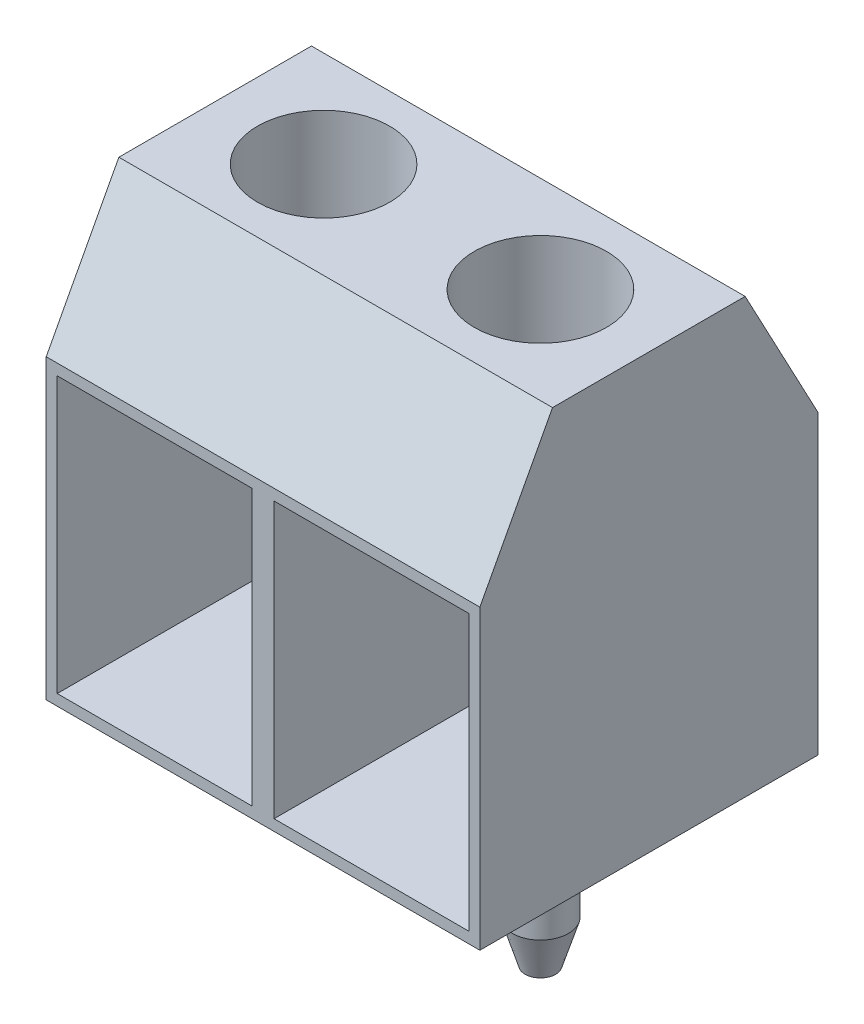
ISO-10303-21;
HEADER;
FILE_DESCRIPTION(('STEP AP214'),'2;1');
FILE_NAME('part.step','',(''),(''),'','','');
FILE_SCHEMA(('AUTOMOTIVE_DESIGN { 1 0 10303 214 1 1 1 1 }'));
ENDSEC;
DATA;
#1=APPLICATION_CONTEXT('core data for automotive mechanical design processes');
#2=APPLICATION_PROTOCOL_DEFINITION('international standard','automotive_design',2000,#1);
#3=PRODUCT_CONTEXT('',#1,'mechanical');
#4=PRODUCT('Part','Part','',(#3));
#5=PRODUCT_RELATED_PRODUCT_CATEGORY('part','',(#4));
#6=PRODUCT_DEFINITION_FORMATION('','',#4);
#7=PRODUCT_DEFINITION_CONTEXT('part definition',#1,'design');
#8=PRODUCT_DEFINITION('design','',#6,#7);
#9=PRODUCT_DEFINITION_SHAPE('','',#8);
#10=(LENGTH_UNIT() NAMED_UNIT(*) SI_UNIT(.MILLI.,.METRE.));
#11=(NAMED_UNIT(*) PLANE_ANGLE_UNIT() SI_UNIT($,.RADIAN.));
#12=(NAMED_UNIT(*) SI_UNIT($,.STERADIAN.) SOLID_ANGLE_UNIT());
#13=UNCERTAINTY_MEASURE_WITH_UNIT(LENGTH_MEASURE(1.E-05),#10,'distance_accuracy_value','');
#14=(GEOMETRIC_REPRESENTATION_CONTEXT(3) GLOBAL_UNCERTAINTY_ASSIGNED_CONTEXT((#13)) GLOBAL_UNIT_ASSIGNED_CONTEXT((#10,
#11,#12)) REPRESENTATION_CONTEXT('',''));
#15=CARTESIAN_POINT('',(0.,0.,0.));
#16=DIRECTION('',(0.,0.,1.));
#17=DIRECTION('',(1.,0.,0.));
#18=AXIS2_PLACEMENT_3D('',#15,#16,#17);
#19=CARTESIAN_POINT('',(5.0038,10.0076,3.8989));
#20=DIRECTION('',(-1.,0.,0.));
#21=DIRECTION('',(0.,0.,1.));
#22=AXIS2_PLACEMENT_3D('',#19,#20,#21);
#23=PLANE('',#22);
#24=DIRECTION('',(0.,-1.,0.));
#25=VECTOR('',#24,1.);
#26=CARTESIAN_POINT('',(5.0038,10.0076,-3.8989));
#27=LINE('',#26,#25);
#28=CARTESIAN_POINT('',(5.0038,6.858,-3.8989));
#29=VERTEX_POINT('',#28);
#30=CARTESIAN_POINT('',(5.0038,0.,-3.8989));
#31=VERTEX_POINT('',#30);
#32=EDGE_CURVE('E11',#29,#31,#27,.T.);
#33=ORIENTED_EDGE('',*,*,#32,.F.);
#34=DIRECTION('',(0.,0.882746759079244,0.469849081445404));
#35=VECTOR('',#34,1.);
#36=CARTESIAN_POINT('',(5.0038,3.13105846340969,-5.88259468883033));
#37=LINE('',#36,#35);
#38=CARTESIAN_POINT('',(5.0038,10.0076,-2.2225));
#39=VERTEX_POINT('',#38);
#40=EDGE_CURVE('E256',#29,#39,#37,.T.);
#41=ORIENTED_EDGE('',*,*,#40,.T.);
#42=DIRECTION('',(0.,0.,-1.));
#43=VECTOR('',#42,1.);
#44=CARTESIAN_POINT('',(5.0038,10.0076,3.8989));
#45=LINE('',#44,#43);
#46=CARTESIAN_POINT('',(5.0038,10.0076,2.2225));
#47=VERTEX_POINT('',#46);
#48=EDGE_CURVE('E284',#47,#39,#45,.T.);
#49=ORIENTED_EDGE('',*,*,#48,.F.);
#50=DIRECTION('',(0.,-0.882746759079244,0.469849081445404));
#51=VECTOR('',#50,1.);
#52=CARTESIAN_POINT('',(5.0038,3.13105846340969,5.88259468883033));
#53=LINE('',#52,#51);
#54=CARTESIAN_POINT('',(5.0038,6.858,3.8989));
#55=VERTEX_POINT('',#54);
#56=EDGE_CURVE('E272',#47,#55,#53,.T.);
#57=ORIENTED_EDGE('',*,*,#56,.T.);
#58=DIRECTION('',(0.,-1.,0.));
#59=VECTOR('',#58,1.);
#60=CARTESIAN_POINT('',(5.0038,10.0076,3.8989));
#61=LINE('',#60,#59);
#62=CARTESIAN_POINT('',(5.0038,0.,3.8989));
#63=VERTEX_POINT('',#62);
#64=EDGE_CURVE('E293',#55,#63,#61,.T.);
#65=ORIENTED_EDGE('',*,*,#64,.T.);
#66=DIRECTION('',(0.,0.,-1.));
#67=VECTOR('',#66,1.);
#68=CARTESIAN_POINT('',(5.0038,0.,3.8989));
#69=LINE('',#68,#67);
#70=EDGE_CURVE('E269',#63,#31,#69,.T.);
#71=ORIENTED_EDGE('',*,*,#70,.T.);
#72=EDGE_LOOP('',(#33,#41,#49,#57,#65,#71));
#73=FACE_BOUND('',#72,.T.);
#74=ADVANCED_FACE('F43',(#73),#23,.F.);
#75=CARTESIAN_POINT('',(-5.0038,10.0076,-3.8989));
#76=DIRECTION('',(0.,0.,1.));
#77=DIRECTION('',(1.,0.,0.));
#78=AXIS2_PLACEMENT_3D('',#75,#76,#77);
#79=PLANE('',#78);
#80=DIRECTION('',(0.,-1.,0.));
#81=VECTOR('',#80,1.);
#82=CARTESIAN_POINT('',(-5.0038,10.0076,-3.8989));
#83=LINE('',#82,#81);
#84=CARTESIAN_POINT('',(-5.0038,6.858,-3.8989));
#85=VERTEX_POINT('',#84);
#86=CARTESIAN_POINT('',(-5.0038,0.,-3.8989));
#87=VERTEX_POINT('',#86);
#88=EDGE_CURVE('E51',#85,#87,#83,.T.);
#89=ORIENTED_EDGE('',*,*,#88,.F.);
#90=DIRECTION('',(-1.,0.,0.));
#91=VECTOR('',#90,1.);
#92=CARTESIAN_POINT('',(5.0038,6.858,-3.8989));
#93=LINE('',#92,#91);
#94=EDGE_CURVE('E260',#29,#85,#93,.T.);
#95=ORIENTED_EDGE('',*,*,#94,.F.);
#96=ORIENTED_EDGE('',*,*,#32,.T.);
#97=DIRECTION('',(-1.,0.,0.));
#98=VECTOR('',#97,1.);
#99=CARTESIAN_POINT('',(-5.0038,0.,-3.8989));
#100=LINE('',#99,#98);
#101=EDGE_CURVE('E297',#31,#87,#100,.T.);
#102=ORIENTED_EDGE('',*,*,#101,.T.);
#103=EDGE_LOOP('',(#89,#95,#96,#102));
#104=FACE_BOUND('',#103,.T.);
#105=ADVANCED_FACE('F324',(#104),#79,.F.);
#106=CARTESIAN_POINT('',(-5.0038,10.0076,3.8989));
#107=DIRECTION('',(1.,0.,0.));
#108=DIRECTION('',(0.,0.,-1.));
#109=AXIS2_PLACEMENT_3D('',#106,#107,#108);
#110=PLANE('',#109);
#111=DIRECTION('',(0.,0.,1.));
#112=VECTOR('',#111,1.);
#113=CARTESIAN_POINT('',(-5.0038,10.0076,3.8989));
#114=LINE('',#113,#112);
#115=CARTESIAN_POINT('',(-5.0038,10.0076,-2.2225));
#116=VERTEX_POINT('',#115);
#117=CARTESIAN_POINT('',(-5.0038,10.0076,2.2225));
#118=VERTEX_POINT('',#117);
#119=EDGE_CURVE('E288',#116,#118,#114,.T.);
#120=ORIENTED_EDGE('',*,*,#119,.F.);
#121=DIRECTION('',(0.,0.882746759079244,0.469849081445404));
#122=VECTOR('',#121,1.);
#123=CARTESIAN_POINT('',(-5.0038,3.13105846340969,-5.88259468883033));
#124=LINE('',#123,#122);
#125=EDGE_CURVE('E261',#85,#116,#124,.T.);
#126=ORIENTED_EDGE('',*,*,#125,.F.);
#127=ORIENTED_EDGE('',*,*,#88,.T.);
#128=DIRECTION('',(0.,0.,1.));
#129=VECTOR('',#128,1.);
#130=CARTESIAN_POINT('',(-5.0038,0.,3.8989));
#131=LINE('',#130,#129);
#132=CARTESIAN_POINT('',(-5.0038,0.,3.8989));
#133=VERTEX_POINT('',#132);
#134=EDGE_CURVE('E301',#87,#133,#131,.T.);
#135=ORIENTED_EDGE('',*,*,#134,.T.);
#136=DIRECTION('',(0.,-1.,0.));
#137=VECTOR('',#136,1.);
#138=CARTESIAN_POINT('',(-5.0038,10.0076,3.8989));
#139=LINE('',#138,#137);
#140=CARTESIAN_POINT('',(-5.0038,6.858,3.8989));
#141=VERTEX_POINT('',#140);
#142=EDGE_CURVE('E310',#141,#133,#139,.T.);
#143=ORIENTED_EDGE('',*,*,#142,.F.);
#144=DIRECTION('',(0.,-0.882746759079244,0.469849081445404));
#145=VECTOR('',#144,1.);
#146=CARTESIAN_POINT('',(-5.0038,3.13105846340969,5.88259468883033));
#147=LINE('',#146,#145);
#148=EDGE_CURVE('E244',#118,#141,#147,.T.);
#149=ORIENTED_EDGE('',*,*,#148,.F.);
#150=EDGE_LOOP('',(#120,#126,#127,#135,#143,#149));
#151=FACE_BOUND('',#150,.T.);
#152=ADVANCED_FACE('F317',(#151),#110,.F.);
#153=CARTESIAN_POINT('',(-5.0038,10.0076,3.8989));
#154=DIRECTION('',(0.,0.,-1.));
#155=DIRECTION('',(-1.,0.,0.));
#156=AXIS2_PLACEMENT_3D('',#153,#154,#155);
#157=PLANE('',#156);
#158=DIRECTION('',(0.,-1.,0.));
#159=VECTOR('',#158,1.);
#160=CARTESIAN_POINT('',(-4.7498,6.604,3.8989));
#161=LINE('',#160,#159);
#162=CARTESIAN_POINT('',(-4.7498,6.604,3.8989));
#163=VERTEX_POINT('',#162);
#164=CARTESIAN_POINT('',(-4.7498,0.254,3.8989));
#165=VERTEX_POINT('',#164);
#166=EDGE_CURVE('E182',#163,#165,#161,.T.);
#167=ORIENTED_EDGE('',*,*,#166,.F.);
#168=DIRECTION('',(-1.,0.,0.));
#169=VECTOR('',#168,1.);
#170=CARTESIAN_POINT('',(-0.254000000000001,6.604,3.8989));
#171=LINE('',#170,#169);
#172=CARTESIAN_POINT('',(-0.254000000000001,6.604,3.8989));
#173=VERTEX_POINT('',#172);
#174=EDGE_CURVE('E58',#173,#163,#171,.T.);
#175=ORIENTED_EDGE('',*,*,#174,.F.);
#176=DIRECTION('',(0.,1.,0.));
#177=VECTOR('',#176,1.);
#178=CARTESIAN_POINT('',(-0.254000000000001,6.604,3.8989));
#179=LINE('',#178,#177);
#180=CARTESIAN_POINT('',(-0.254000000000001,0.254,3.8989));
#181=VERTEX_POINT('',#180);
#182=EDGE_CURVE('E166',#181,#173,#179,.T.);
#183=ORIENTED_EDGE('',*,*,#182,.F.);
#184=DIRECTION('',(1.,0.,0.));
#185=VECTOR('',#184,1.);
#186=CARTESIAN_POINT('',(-4.7498,0.254,3.8989));
#187=LINE('',#186,#185);
#188=EDGE_CURVE('E170',#165,#181,#187,.T.);
#189=ORIENTED_EDGE('',*,*,#188,.F.);
#190=EDGE_LOOP('',(#167,#175,#183,#189));
#191=FACE_BOUND('',#190,.T.);
#192=DIRECTION('',(0.,-1.,0.));
#193=VECTOR('',#192,1.);
#194=CARTESIAN_POINT('',(0.253999999999999,6.604,3.8989));
#195=LINE('',#194,#193);
#196=CARTESIAN_POINT('',(0.253999999999999,6.604,3.8989));
#197=VERTEX_POINT('',#196);
#198=CARTESIAN_POINT('',(0.253999999999999,0.254,3.8989));
#199=VERTEX_POINT('',#198);
#200=EDGE_CURVE('E220',#197,#199,#195,.T.);
#201=ORIENTED_EDGE('',*,*,#200,.F.);
#202=DIRECTION('',(-1.,0.,0.));
#203=VECTOR('',#202,1.);
#204=CARTESIAN_POINT('',(4.7498,6.604,3.8989));
#205=LINE('',#204,#203);
#206=CARTESIAN_POINT('',(4.7498,6.604,3.8989));
#207=VERTEX_POINT('',#206);
#208=EDGE_CURVE('E66',#207,#197,#205,.T.);
#209=ORIENTED_EDGE('',*,*,#208,.F.);
#210=DIRECTION('',(0.,1.,0.));
#211=VECTOR('',#210,1.);
#212=CARTESIAN_POINT('',(4.7498,0.254,3.8989));
#213=LINE('',#212,#211);
#214=CARTESIAN_POINT('',(4.7498,0.254,3.8989));
#215=VERTEX_POINT('',#214);
#216=EDGE_CURVE('E211',#215,#207,#213,.T.);
#217=ORIENTED_EDGE('',*,*,#216,.F.);
#218=DIRECTION('',(1.,0.,0.));
#219=VECTOR('',#218,1.);
#220=CARTESIAN_POINT('',(0.253999999999999,0.254,3.8989));
#221=LINE('',#220,#219);
#222=EDGE_CURVE('E215',#199,#215,#221,.T.);
#223=ORIENTED_EDGE('',*,*,#222,.F.);
#224=EDGE_LOOP('',(#201,#209,#217,#223));
#225=FACE_BOUND('',#224,.T.);
#226=ORIENTED_EDGE('',*,*,#64,.F.);
#227=DIRECTION('',(-1.,0.,0.));
#228=VECTOR('',#227,1.);
#229=CARTESIAN_POINT('',(5.0038,6.858,3.8989));
#230=LINE('',#229,#228);
#231=EDGE_CURVE('E264',#55,#141,#230,.T.);
#232=ORIENTED_EDGE('',*,*,#231,.T.);
#233=ORIENTED_EDGE('',*,*,#142,.T.);
#234=DIRECTION('',(1.,0.,0.));
#235=VECTOR('',#234,1.);
#236=CARTESIAN_POINT('',(-5.0038,0.,3.8989));
#237=LINE('',#236,#235);
#238=EDGE_CURVE('E289',#133,#63,#237,.T.);
#239=ORIENTED_EDGE('',*,*,#238,.T.);
#240=EDGE_LOOP('',(#226,#232,#233,#239));
#241=FACE_BOUND('',#240,.T.);
#242=ADVANCED_FACE('F331',(#191,#225,#241),#157,.F.);
#243=CARTESIAN_POINT('',(0.,10.0076,0.));
#244=DIRECTION('',(0.,-1.,0.));
#245=DIRECTION('',(0.,0.,-1.));
#246=AXIS2_PLACEMENT_3D('',#243,#244,#245);
#247=PLANE('',#246);
#248=CARTESIAN_POINT('',(-2.5019,10.0076,0.));
#249=DIRECTION('',(0.,1.,0.));
#250=DIRECTION('',(0.,0.,1.));
#251=AXIS2_PLACEMENT_3D('',#248,#249,#250);
#252=CIRCLE('',#251,1.524);
#253=CARTESIAN_POINT('',(-2.5019,10.0076,1.524));
#254=VERTEX_POINT('',#253);
#255=EDGE_CURVE('E245',#254,#254,#252,.T.);
#256=ORIENTED_EDGE('',*,*,#255,.F.);
#257=EDGE_LOOP('',(#256));
#258=FACE_BOUND('',#257,.T.);
#259=CARTESIAN_POINT('',(2.5019,10.0076,0.));
#260=DIRECTION('',(0.,1.,0.));
#261=DIRECTION('',(0.,0.,1.));
#262=AXIS2_PLACEMENT_3D('',#259,#260,#261);
#263=CIRCLE('',#262,1.524);
#264=CARTESIAN_POINT('',(2.5019,10.0076,1.524));
#265=VERTEX_POINT('',#264);
#266=EDGE_CURVE('E249',#265,#265,#263,.T.);
#267=ORIENTED_EDGE('',*,*,#266,.F.);
#268=EDGE_LOOP('',(#267));
#269=FACE_BOUND('',#268,.T.);
#270=ORIENTED_EDGE('',*,*,#48,.T.);
#271=DIRECTION('',(-1.,0.,0.));
#272=VECTOR('',#271,1.);
#273=CARTESIAN_POINT('',(5.0038,10.0076,-2.2225));
#274=LINE('',#273,#272);
#275=EDGE_CURVE('E265',#39,#116,#274,.T.);
#276=ORIENTED_EDGE('',*,*,#275,.T.);
#277=ORIENTED_EDGE('',*,*,#119,.T.);
#278=DIRECTION('',(-1.,0.,0.));
#279=VECTOR('',#278,1.);
#280=CARTESIAN_POINT('',(5.0038,10.0076,2.2225));
#281=LINE('',#280,#279);
#282=EDGE_CURVE('E276',#47,#118,#281,.T.);
#283=ORIENTED_EDGE('',*,*,#282,.F.);
#284=EDGE_LOOP('',(#270,#276,#277,#283));
#285=FACE_BOUND('',#284,.T.);
#286=ADVANCED_FACE('F336',(#258,#269,#285),#247,.F.);
#287=CARTESIAN_POINT('',(0.,0.,0.));
#288=DIRECTION('',(0.,-1.,0.));
#289=DIRECTION('',(0.,0.,-1.));
#290=AXIS2_PLACEMENT_3D('',#287,#288,#289);
#291=PLANE('',#290);
#292=CARTESIAN_POINT('',(2.5019,0.,0.));
#293=DIRECTION('',(0.,-1.,0.));
#294=DIRECTION('',(0.,0.,-1.));
#295=AXIS2_PLACEMENT_3D('',#292,#293,#294);
#296=CIRCLE('',#295,0.6477);
#297=CARTESIAN_POINT('',(2.5019,0.,-0.6477));
#298=VERTEX_POINT('',#297);
#299=EDGE_CURVE('E458',#298,#298,#296,.T.);
#300=ORIENTED_EDGE('',*,*,#299,.F.);
#301=EDGE_LOOP('',(#300));
#302=FACE_BOUND('',#301,.T.);
#303=CARTESIAN_POINT('',(-2.5019,0.,0.));
#304=DIRECTION('',(0.,-1.,0.));
#305=DIRECTION('',(0.,0.,-1.));
#306=AXIS2_PLACEMENT_3D('',#303,#304,#305);
#307=CIRCLE('',#306,0.6477);
#308=CARTESIAN_POINT('',(-2.5019,0.,-0.647699999999999));
#309=VERTEX_POINT('',#308);
#310=EDGE_CURVE('E173',#309,#309,#307,.T.);
#311=ORIENTED_EDGE('',*,*,#310,.F.);
#312=EDGE_LOOP('',(#311));
#313=FACE_BOUND('',#312,.T.);
#314=ORIENTED_EDGE('',*,*,#70,.F.);
#315=ORIENTED_EDGE('',*,*,#238,.F.);
#316=ORIENTED_EDGE('',*,*,#134,.F.);
#317=ORIENTED_EDGE('',*,*,#101,.F.);
#318=EDGE_LOOP('',(#314,#315,#316,#317));
#319=FACE_BOUND('',#318,.T.);
#320=ADVANCED_FACE('F328',(#302,#313,#319),#291,.T.);
#321=CARTESIAN_POINT('',(5.0038,3.13105846340969,5.88259468883033));
#322=DIRECTION('',(0.,-0.469849081445404,-0.882746759079244));
#323=DIRECTION('',(0.,0.882746759079244,-0.469849081445404));
#324=AXIS2_PLACEMENT_3D('',#321,#322,#323);
#325=PLANE('',#324);
#326=ORIENTED_EDGE('',*,*,#148,.T.);
#327=ORIENTED_EDGE('',*,*,#231,.F.);
#328=ORIENTED_EDGE('',*,*,#56,.F.);
#329=ORIENTED_EDGE('',*,*,#282,.T.);
#330=EDGE_LOOP('',(#326,#327,#328,#329));
#331=FACE_BOUND('',#330,.T.);
#332=ADVANCED_FACE('F341',(#331),#325,.F.);
#333=CARTESIAN_POINT('',(5.0038,3.13105846340969,-5.88259468883033));
#334=DIRECTION('',(0.,-0.469849081445404,0.882746759079244));
#335=DIRECTION('',(0.,-0.882746759079244,-0.469849081445404));
#336=AXIS2_PLACEMENT_3D('',#333,#334,#335);
#337=PLANE('',#336);
#338=ORIENTED_EDGE('',*,*,#125,.T.);
#339=ORIENTED_EDGE('',*,*,#275,.F.);
#340=ORIENTED_EDGE('',*,*,#40,.F.);
#341=ORIENTED_EDGE('',*,*,#94,.T.);
#342=EDGE_LOOP('',(#338,#339,#340,#341));
#343=FACE_BOUND('',#342,.T.);
#344=ADVANCED_FACE('F339',(#343),#337,.F.);
#345=CARTESIAN_POINT('',(2.5019,7.4676,0.));
#346=DIRECTION('',(0.,1.,0.));
#347=DIRECTION('',(0.,0.,1.));
#348=AXIS2_PLACEMENT_3D('',#345,#346,#347);
#349=CYLINDRICAL_SURFACE('',#348,1.524);
#350=CARTESIAN_POINT('',(2.5019,7.4676,0.));
#351=DIRECTION('',(0.,1.,0.));
#352=DIRECTION('',(0.,0.,1.));
#353=AXIS2_PLACEMENT_3D('',#350,#351,#352);
#354=CIRCLE('',#353,1.524);
#355=CARTESIAN_POINT('',(2.5019,7.4676,1.524));
#356=VERTEX_POINT('',#355);
#357=EDGE_CURVE('E191',#356,#356,#354,.T.);
#358=ORIENTED_EDGE('',*,*,#357,.F.);
#359=EDGE_LOOP('',(#358));
#360=FACE_BOUND('',#359,.T.);
#361=ORIENTED_EDGE('',*,*,#266,.T.);
#362=EDGE_LOOP('',(#361));
#363=FACE_BOUND('',#362,.T.);
#364=ADVANCED_FACE('F348',(#360,#363),#349,.F.);
#365=CARTESIAN_POINT('',(2.5019,7.4676,0.));
#366=DIRECTION('',(0.,1.,0.));
#367=DIRECTION('',(0.,0.,1.));
#368=AXIS2_PLACEMENT_3D('',#365,#366,#367);
#369=PLANE('',#368);
#370=ORIENTED_EDGE('',*,*,#357,.T.);
#371=EDGE_LOOP('',(#370));
#372=FACE_BOUND('',#371,.T.);
#373=ADVANCED_FACE('F373',(#372),#369,.T.);
#374=CARTESIAN_POINT('',(-2.5019,7.4676,0.));
#375=DIRECTION('',(0.,1.,0.));
#376=DIRECTION('',(0.,0.,1.));
#377=AXIS2_PLACEMENT_3D('',#374,#375,#376);
#378=CYLINDRICAL_SURFACE('',#377,1.524);
#379=CARTESIAN_POINT('',(-2.5019,7.4676,0.));
#380=DIRECTION('',(0.,1.,0.));
#381=DIRECTION('',(0.,0.,1.));
#382=AXIS2_PLACEMENT_3D('',#379,#380,#381);
#383=CIRCLE('',#382,1.524);
#384=CARTESIAN_POINT('',(-2.5019,7.4676,1.524));
#385=VERTEX_POINT('',#384);
#386=EDGE_CURVE('E240',#385,#385,#383,.T.);
#387=ORIENTED_EDGE('',*,*,#386,.F.);
#388=EDGE_LOOP('',(#387));
#389=FACE_BOUND('',#388,.T.);
#390=ORIENTED_EDGE('',*,*,#255,.T.);
#391=EDGE_LOOP('',(#390));
#392=FACE_BOUND('',#391,.T.);
#393=ADVANCED_FACE('F379',(#389,#392),#378,.F.);
#394=CARTESIAN_POINT('',(-2.5019,7.4676,0.));
#395=DIRECTION('',(0.,1.,0.));
#396=DIRECTION('',(0.,0.,1.));
#397=AXIS2_PLACEMENT_3D('',#394,#395,#396);
#398=PLANE('',#397);
#399=ORIENTED_EDGE('',*,*,#386,.T.);
#400=EDGE_LOOP('',(#399));
#401=FACE_BOUND('',#400,.T.);
#402=ADVANCED_FACE('F386',(#401),#398,.T.);
#403=CARTESIAN_POINT('',(4.7498,6.604,-1.1811));
#404=DIRECTION('',(0.,1.,0.));
#405=DIRECTION('',(0.,0.,1.));
#406=AXIS2_PLACEMENT_3D('',#403,#404,#405);
#407=PLANE('',#406);
#408=ORIENTED_EDGE('',*,*,#208,.T.);
#409=DIRECTION('',(0.,0.,1.));
#410=VECTOR('',#409,1.);
#411=CARTESIAN_POINT('',(0.253999999999999,6.604,-1.1811));
#412=LINE('',#411,#410);
#413=CARTESIAN_POINT('',(0.253999999999999,6.604,-1.1811));
#414=VERTEX_POINT('',#413);
#415=EDGE_CURVE('E197',#414,#197,#412,.T.);
#416=ORIENTED_EDGE('',*,*,#415,.F.);
#417=DIRECTION('',(-1.,0.,0.));
#418=VECTOR('',#417,1.);
#419=CARTESIAN_POINT('',(4.7498,6.604,-1.1811));
#420=LINE('',#419,#418);
#421=CARTESIAN_POINT('',(4.7498,6.604,-1.1811));
#422=VERTEX_POINT('',#421);
#423=EDGE_CURVE('E216',#422,#414,#420,.T.);
#424=ORIENTED_EDGE('',*,*,#423,.F.);
#425=DIRECTION('',(0.,0.,1.));
#426=VECTOR('',#425,1.);
#427=CARTESIAN_POINT('',(4.7498,6.604,-1.1811));
#428=LINE('',#427,#426);
#429=EDGE_CURVE('E207',#422,#207,#428,.T.);
#430=ORIENTED_EDGE('',*,*,#429,.T.);
#431=EDGE_LOOP('',(#408,#416,#424,#430));
#432=FACE_BOUND('',#431,.T.);
#433=ADVANCED_FACE('F390',(#432),#407,.F.);
#434=CARTESIAN_POINT('',(4.7498,0.254,-1.1811));
#435=DIRECTION('',(1.,0.,0.));
#436=DIRECTION('',(0.,0.,-1.));
#437=AXIS2_PLACEMENT_3D('',#434,#435,#436);
#438=PLANE('',#437);
#439=ORIENTED_EDGE('',*,*,#216,.T.);
#440=ORIENTED_EDGE('',*,*,#429,.F.);
#441=DIRECTION('',(0.,1.,0.));
#442=VECTOR('',#441,1.);
#443=CARTESIAN_POINT('',(4.7498,0.254,-1.1811));
#444=LINE('',#443,#442);
#445=CARTESIAN_POINT('',(4.7498,0.254,-1.1811));
#446=VERTEX_POINT('',#445);
#447=EDGE_CURVE('E200',#446,#422,#444,.T.);
#448=ORIENTED_EDGE('',*,*,#447,.F.);
#449=DIRECTION('',(0.,0.,1.));
#450=VECTOR('',#449,1.);
#451=CARTESIAN_POINT('',(4.7498,0.254,-1.1811));
#452=LINE('',#451,#450);
#453=EDGE_CURVE('E204',#446,#215,#452,.T.);
#454=ORIENTED_EDGE('',*,*,#453,.T.);
#455=EDGE_LOOP('',(#439,#440,#448,#454));
#456=FACE_BOUND('',#455,.T.);
#457=ADVANCED_FACE('F397',(#456),#438,.F.);
#458=CARTESIAN_POINT('',(0.253999999999999,0.254,-1.1811));
#459=DIRECTION('',(0.,-1.,0.));
#460=DIRECTION('',(1.,0.,0.));
#461=AXIS2_PLACEMENT_3D('',#458,#459,#460);
#462=PLANE('',#461);
#463=ORIENTED_EDGE('',*,*,#222,.T.);
#464=ORIENTED_EDGE('',*,*,#453,.F.);
#465=DIRECTION('',(1.,0.,0.));
#466=VECTOR('',#465,1.);
#467=CARTESIAN_POINT('',(0.253999999999999,0.254,-1.1811));
#468=LINE('',#467,#466);
#469=CARTESIAN_POINT('',(0.253999999999999,0.254,-1.1811));
#470=VERTEX_POINT('',#469);
#471=EDGE_CURVE('E229',#470,#446,#468,.T.);
#472=ORIENTED_EDGE('',*,*,#471,.F.);
#473=DIRECTION('',(0.,0.,1.));
#474=VECTOR('',#473,1.);
#475=CARTESIAN_POINT('',(0.253999999999999,0.254,-1.1811));
#476=LINE('',#475,#474);
#477=EDGE_CURVE('E201',#470,#199,#476,.T.);
#478=ORIENTED_EDGE('',*,*,#477,.T.);
#479=EDGE_LOOP('',(#463,#464,#472,#478));
#480=FACE_BOUND('',#479,.T.);
#481=ADVANCED_FACE('F400',(#480),#462,.F.);
#482=CARTESIAN_POINT('',(0.253999999999999,6.604,-1.1811));
#483=DIRECTION('',(-1.,0.,0.));
#484=DIRECTION('',(0.,0.,1.));
#485=AXIS2_PLACEMENT_3D('',#482,#483,#484);
#486=PLANE('',#485);
#487=ORIENTED_EDGE('',*,*,#200,.T.);
#488=ORIENTED_EDGE('',*,*,#477,.F.);
#489=DIRECTION('',(0.,-1.,0.));
#490=VECTOR('',#489,1.);
#491=CARTESIAN_POINT('',(0.253999999999999,6.604,-1.1811));
#492=LINE('',#491,#490);
#493=EDGE_CURVE('E233',#414,#470,#492,.T.);
#494=ORIENTED_EDGE('',*,*,#493,.F.);
#495=ORIENTED_EDGE('',*,*,#415,.T.);
#496=EDGE_LOOP('',(#487,#488,#494,#495));
#497=FACE_BOUND('',#496,.T.);
#498=ADVANCED_FACE('F395',(#497),#486,.F.);
#499=CARTESIAN_POINT('',(0.,0.,-1.1811));
#500=DIRECTION('',(0.,0.,1.));
#501=DIRECTION('',(1.,0.,0.));
#502=AXIS2_PLACEMENT_3D('',#499,#500,#501);
#503=PLANE('',#502);
#504=ORIENTED_EDGE('',*,*,#423,.T.);
#505=ORIENTED_EDGE('',*,*,#493,.T.);
#506=ORIENTED_EDGE('',*,*,#471,.T.);
#507=ORIENTED_EDGE('',*,*,#447,.T.);
#508=EDGE_LOOP('',(#504,#505,#506,#507));
#509=FACE_BOUND('',#508,.T.);
#510=ADVANCED_FACE('F392',(#509),#503,.T.);
#511=CARTESIAN_POINT('',(-0.254000000000001,6.604,-1.1811));
#512=DIRECTION('',(0.,1.,0.));
#513=DIRECTION('',(0.,0.,1.));
#514=AXIS2_PLACEMENT_3D('',#511,#512,#513);
#515=PLANE('',#514);
#516=ORIENTED_EDGE('',*,*,#174,.T.);
#517=DIRECTION('',(0.,0.,1.));
#518=VECTOR('',#517,1.);
#519=CARTESIAN_POINT('',(-4.7498,6.604,-1.1811));
#520=LINE('',#519,#518);
#521=CARTESIAN_POINT('',(-4.7498,6.604,-1.1811));
#522=VERTEX_POINT('',#521);
#523=EDGE_CURVE('E141',#522,#163,#520,.T.);
#524=ORIENTED_EDGE('',*,*,#523,.F.);
#525=DIRECTION('',(-1.,0.,0.));
#526=VECTOR('',#525,1.);
#527=CARTESIAN_POINT('',(-0.254000000000001,6.604,-1.1811));
#528=LINE('',#527,#526);
#529=CARTESIAN_POINT('',(-0.254000000000001,6.604,-1.1811));
#530=VERTEX_POINT('',#529);
#531=EDGE_CURVE('E145',#530,#522,#528,.T.);
#532=ORIENTED_EDGE('',*,*,#531,.F.);
#533=DIRECTION('',(0.,0.,1.));
#534=VECTOR('',#533,1.);
#535=CARTESIAN_POINT('',(-0.254000000000001,6.604,-1.1811));
#536=LINE('',#535,#534);
#537=EDGE_CURVE('E188',#530,#173,#536,.T.);
#538=ORIENTED_EDGE('',*,*,#537,.T.);
#539=EDGE_LOOP('',(#516,#524,#532,#538));
#540=FACE_BOUND('',#539,.T.);
#541=ADVANCED_FACE('F143',(#540),#515,.F.);
#542=CARTESIAN_POINT('',(-0.254000000000001,6.604,-1.1811));
#543=DIRECTION('',(1.,0.,0.));
#544=DIRECTION('',(0.,0.,-1.));
#545=AXIS2_PLACEMENT_3D('',#542,#543,#544);
#546=PLANE('',#545);
#547=ORIENTED_EDGE('',*,*,#182,.T.);
#548=ORIENTED_EDGE('',*,*,#537,.F.);
#549=DIRECTION('',(0.,1.,0.));
#550=VECTOR('',#549,1.);
#551=CARTESIAN_POINT('',(-0.254000000000001,6.604,-1.1811));
#552=LINE('',#551,#550);
#553=CARTESIAN_POINT('',(-0.254000000000001,0.254,-1.1811));
#554=VERTEX_POINT('',#553);
#555=EDGE_CURVE('E152',#554,#530,#552,.T.);
#556=ORIENTED_EDGE('',*,*,#555,.F.);
#557=DIRECTION('',(0.,0.,1.));
#558=VECTOR('',#557,1.);
#559=CARTESIAN_POINT('',(-0.254000000000001,0.254,-1.1811));
#560=LINE('',#559,#558);
#561=EDGE_CURVE('E192',#554,#181,#560,.T.);
#562=ORIENTED_EDGE('',*,*,#561,.T.);
#563=EDGE_LOOP('',(#547,#548,#556,#562));
#564=FACE_BOUND('',#563,.T.);
#565=ADVANCED_FACE('F412',(#564),#546,.F.);
#566=CARTESIAN_POINT('',(-4.7498,0.254,-1.1811));
#567=DIRECTION('',(0.,-1.,0.));
#568=DIRECTION('',(1.,0.,0.));
#569=AXIS2_PLACEMENT_3D('',#566,#567,#568);
#570=PLANE('',#569);
#571=ORIENTED_EDGE('',*,*,#188,.T.);
#572=ORIENTED_EDGE('',*,*,#561,.F.);
#573=DIRECTION('',(1.,0.,0.));
#574=VECTOR('',#573,1.);
#575=CARTESIAN_POINT('',(-4.7498,0.254,-1.1811));
#576=LINE('',#575,#574);
#577=CARTESIAN_POINT('',(-4.7498,0.254,-1.1811));
#578=VERTEX_POINT('',#577);
#579=EDGE_CURVE('E161',#578,#554,#576,.T.);
#580=ORIENTED_EDGE('',*,*,#579,.F.);
#581=DIRECTION('',(0.,0.,1.));
#582=VECTOR('',#581,1.);
#583=CARTESIAN_POINT('',(-4.7498,0.254,-1.1811));
#584=LINE('',#583,#582);
#585=EDGE_CURVE('E151',#578,#165,#584,.T.);
#586=ORIENTED_EDGE('',*,*,#585,.T.);
#587=EDGE_LOOP('',(#571,#572,#580,#586));
#588=FACE_BOUND('',#587,.T.);
#589=ADVANCED_FACE('F415',(#588),#570,.F.);
#590=CARTESIAN_POINT('',(-4.7498,6.604,-1.1811));
#591=DIRECTION('',(-1.,0.,0.));
#592=DIRECTION('',(0.,0.,1.));
#593=AXIS2_PLACEMENT_3D('',#590,#591,#592);
#594=PLANE('',#593);
#595=ORIENTED_EDGE('',*,*,#166,.T.);
#596=ORIENTED_EDGE('',*,*,#585,.F.);
#597=DIRECTION('',(0.,-1.,0.));
#598=VECTOR('',#597,1.);
#599=CARTESIAN_POINT('',(-4.7498,6.604,-1.1811));
#600=LINE('',#599,#598);
#601=EDGE_CURVE('E155',#522,#578,#600,.T.);
#602=ORIENTED_EDGE('',*,*,#601,.F.);
#603=ORIENTED_EDGE('',*,*,#523,.T.);
#604=EDGE_LOOP('',(#595,#596,#602,#603));
#605=FACE_BOUND('',#604,.T.);
#606=ADVANCED_FACE('F156',(#605),#594,.F.);
#607=CARTESIAN_POINT('',(0.,0.,-1.1811));
#608=DIRECTION('',(0.,0.,1.));
#609=DIRECTION('',(1.,0.,0.));
#610=AXIS2_PLACEMENT_3D('',#607,#608,#609);
#611=PLANE('',#610);
#612=ORIENTED_EDGE('',*,*,#531,.T.);
#613=ORIENTED_EDGE('',*,*,#601,.T.);
#614=ORIENTED_EDGE('',*,*,#579,.T.);
#615=ORIENTED_EDGE('',*,*,#555,.T.);
#616=EDGE_LOOP('',(#612,#613,#614,#615));
#617=FACE_BOUND('',#616,.T.);
#618=ADVANCED_FACE('F163',(#617),#611,.T.);
#619=CARTESIAN_POINT('',(-2.5019,-2.54,0.));
#620=DIRECTION('',(0.,1.,0.));
#621=DIRECTION('',(0.,0.,1.));
#622=AXIS2_PLACEMENT_3D('',#619,#620,#621);
#623=CYLINDRICAL_SURFACE('',#622,0.6477);
#624=CARTESIAN_POINT('',(-2.5019,-2.54,0.));
#625=DIRECTION('',(0.,-1.,0.));
#626=DIRECTION('',(0.,0.,-1.));
#627=AXIS2_PLACEMENT_3D('',#624,#625,#626);
#628=CIRCLE('',#627,0.6477);
#629=CARTESIAN_POINT('',(-2.5019,-2.54,-0.647699999999999));
#630=VERTEX_POINT('',#629);
#631=EDGE_CURVE('E210',#630,#630,#628,.T.);
#632=ORIENTED_EDGE('',*,*,#631,.F.);
#633=EDGE_LOOP('',(#632));
#634=FACE_BOUND('',#633,.T.);
#635=ORIENTED_EDGE('',*,*,#310,.T.);
#636=EDGE_LOOP('',(#635));
#637=FACE_BOUND('',#636,.T.);
#638=ADVANCED_FACE('F424',(#634,#637),#623,.T.);
#639=CARTESIAN_POINT('',(2.5019,-2.54,0.));
#640=DIRECTION('',(0.,1.,0.));
#641=DIRECTION('',(0.,0.,1.));
#642=AXIS2_PLACEMENT_3D('',#639,#640,#641);
#643=CYLINDRICAL_SURFACE('',#642,0.6477);
#644=CARTESIAN_POINT('',(2.5019,-2.54,0.));
#645=DIRECTION('',(0.,-1.,0.));
#646=DIRECTION('',(0.,0.,-1.));
#647=AXIS2_PLACEMENT_3D('',#644,#645,#646);
#648=CIRCLE('',#647,0.6477);
#649=CARTESIAN_POINT('',(2.5019,-2.54,-0.6477));
#650=VERTEX_POINT('',#649);
#651=EDGE_CURVE('E460',#650,#650,#648,.T.);
#652=ORIENTED_EDGE('',*,*,#651,.F.);
#653=EDGE_LOOP('',(#652));
#654=FACE_BOUND('',#653,.T.);
#655=ORIENTED_EDGE('',*,*,#299,.T.);
#656=EDGE_LOOP('',(#655));
#657=FACE_BOUND('',#656,.T.);
#658=ADVANCED_FACE('F427',(#654,#657),#643,.T.);
#659=CARTESIAN_POINT('',(2.5019,-2.54,0.));
#660=DIRECTION('',(0.,1.,0.));
#661=DIRECTION('',(0.,0.,-1.));
#662=AXIS2_PLACEMENT_3D('',#659,#660,#661);
#663=CONICAL_SURFACE('',#662,0.6477,0.296705972839036);
#664=CARTESIAN_POINT('',(2.5019,-3.5052,0.));
#665=DIRECTION('',(0.,-1.,0.));
#666=DIRECTION('',(0.,0.,-1.));
#667=AXIS2_PLACEMENT_3D('',#664,#665,#666);
#668=CIRCLE('',#667,0.352608746256101);
#669=CARTESIAN_POINT('',(2.5019,-3.5052,-0.352608746256101));
#670=VERTEX_POINT('',#669);
#671=EDGE_CURVE('E464',#670,#670,#668,.T.);
#672=ORIENTED_EDGE('',*,*,#671,.F.);
#673=EDGE_LOOP('',(#672));
#674=FACE_BOUND('',#673,.T.);
#675=ORIENTED_EDGE('',*,*,#651,.T.);
#676=EDGE_LOOP('',(#675));
#677=FACE_BOUND('',#676,.T.);
#678=ADVANCED_FACE('F431',(#674,#677),#663,.T.);
#679=CARTESIAN_POINT('',(2.5019,-3.5052,0.));
#680=DIRECTION('',(0.,-1.,0.));
#681=DIRECTION('',(0.,0.,-1.));
#682=AXIS2_PLACEMENT_3D('',#679,#680,#681);
#683=PLANE('',#682);
#684=ORIENTED_EDGE('',*,*,#671,.T.);
#685=EDGE_LOOP('',(#684));
#686=FACE_BOUND('',#685,.T.);
#687=ADVANCED_FACE('F435',(#686),#683,.T.);
#688=CARTESIAN_POINT('',(-2.5019,-2.54,0.));
#689=DIRECTION('',(0.,1.,0.));
#690=DIRECTION('',(0.,0.,-1.));
#691=AXIS2_PLACEMENT_3D('',#688,#689,#690);
#692=CONICAL_SURFACE('',#691,0.6477,0.296705972839036);
#693=CARTESIAN_POINT('',(-2.5019,-3.5052,0.));
#694=DIRECTION('',(0.,-1.,0.));
#695=DIRECTION('',(0.,0.,-1.));
#696=AXIS2_PLACEMENT_3D('',#693,#694,#695);
#697=CIRCLE('',#696,0.352608746256101);
#698=CARTESIAN_POINT('',(-2.5019,-3.5052,-0.3526087462561));
#699=VERTEX_POINT('',#698);
#700=EDGE_CURVE('E452',#699,#699,#697,.T.);
#701=ORIENTED_EDGE('',*,*,#700,.F.);
#702=EDGE_LOOP('',(#701));
#703=FACE_BOUND('',#702,.T.);
#704=ORIENTED_EDGE('',*,*,#631,.T.);
#705=EDGE_LOOP('',(#704));
#706=FACE_BOUND('',#705,.T.);
#707=ADVANCED_FACE('F439',(#703,#706),#692,.T.);
#708=CARTESIAN_POINT('',(-2.5019,-3.5052,0.));
#709=DIRECTION('',(0.,-1.,0.));
#710=DIRECTION('',(0.,0.,-1.));
#711=AXIS2_PLACEMENT_3D('',#708,#709,#710);
#712=PLANE('',#711);
#713=ORIENTED_EDGE('',*,*,#700,.T.);
#714=EDGE_LOOP('',(#713));
#715=FACE_BOUND('',#714,.T.);
#716=ADVANCED_FACE('F441',(#715),#712,.T.);
#717=CLOSED_SHELL('',(#74,#105,#152,#242,#286,#320,#332,#344,#364,#373,#393,#402,#433,#457,#481,
#498,#510,#541,#565,#589,#606,#618,#638,#658,#678,#687,#707,#716));
#718=MANIFOLD_SOLID_BREP('B2',#717);
#719=ADVANCED_BREP_SHAPE_REPRESENTATION('',(#18,#718),#14);
#720=SHAPE_DEFINITION_REPRESENTATION(#9,#719);
ENDSEC;
END-ISO-10303-21;
